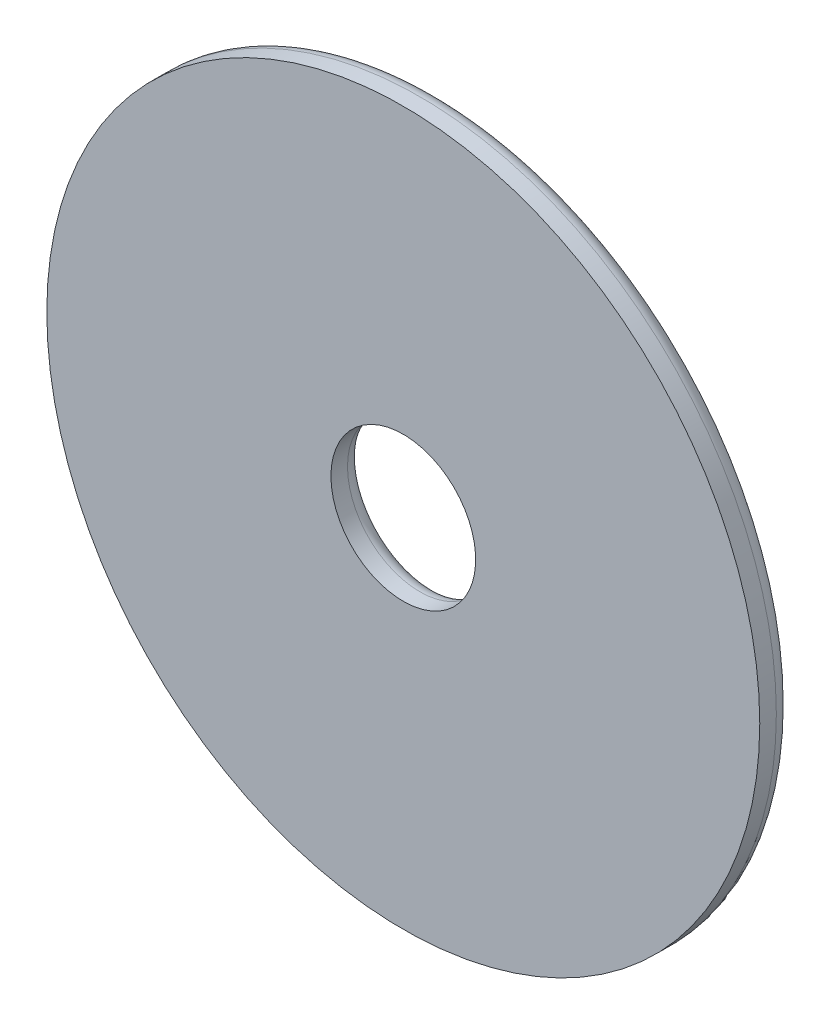
ISO-10303-21;
HEADER;
FILE_DESCRIPTION(('STEP AP214'),'2;1');
FILE_NAME('part.step','',(''),(''),'','','');
FILE_SCHEMA(('AUTOMOTIVE_DESIGN { 1 0 10303 214 1 1 1 1 }'));
ENDSEC;
DATA;
#1=APPLICATION_CONTEXT('core data for automotive mechanical design processes');
#2=APPLICATION_PROTOCOL_DEFINITION('international standard','automotive_design',2000,#1);
#3=PRODUCT_CONTEXT('',#1,'mechanical');
#4=PRODUCT('Part','Part','',(#3));
#5=PRODUCT_RELATED_PRODUCT_CATEGORY('part','',(#4));
#6=PRODUCT_DEFINITION_FORMATION('','',#4);
#7=PRODUCT_DEFINITION_CONTEXT('part definition',#1,'design');
#8=PRODUCT_DEFINITION('design','',#6,#7);
#9=PRODUCT_DEFINITION_SHAPE('','',#8);
#10=(LENGTH_UNIT() NAMED_UNIT(*) SI_UNIT(.MILLI.,.METRE.));
#11=(NAMED_UNIT(*) PLANE_ANGLE_UNIT() SI_UNIT($,.RADIAN.));
#12=(NAMED_UNIT(*) SI_UNIT($,.STERADIAN.) SOLID_ANGLE_UNIT());
#13=UNCERTAINTY_MEASURE_WITH_UNIT(LENGTH_MEASURE(1.E-05),#10,'distance_accuracy_value','');
#14=(GEOMETRIC_REPRESENTATION_CONTEXT(3) GLOBAL_UNCERTAINTY_ASSIGNED_CONTEXT((#13)) GLOBAL_UNIT_ASSIGNED_CONTEXT((#10,
#11,#12)) REPRESENTATION_CONTEXT('',''));
#15=CARTESIAN_POINT('',(0.,0.,0.));
#16=DIRECTION('',(0.,0.,1.));
#17=DIRECTION('',(1.,0.,0.));
#18=AXIS2_PLACEMENT_3D('',#15,#16,#17);
#19=CARTESIAN_POINT('',(0.,0.,0.590550000000005));
#20=DIRECTION('',(0.,0.,1.));
#21=DIRECTION('',(1.,0.,0.));
#22=AXIS2_PLACEMENT_3D('',#19,#20,#21);
#23=PLANE('',#22);
#24=CARTESIAN_POINT('',(0.,0.,0.590550000000005));
#25=DIRECTION('',(0.,0.,1.));
#26=DIRECTION('',(1.,0.,0.));
#27=AXIS2_PLACEMENT_3D('',#24,#25,#26);
#28=CIRCLE('',#27,12.7);
#29=CARTESIAN_POINT('',(-12.7,0.,0.590550000000005));
#30=VERTEX_POINT('',#29);
#31=EDGE_CURVE('E65',#30,#30,#28,.T.);
#32=ORIENTED_EDGE('',*,*,#31,.T.);
#33=EDGE_LOOP('',(#32));
#34=FACE_BOUND('',#33,.T.);
#35=CARTESIAN_POINT('',(0.,0.,0.590550000000005));
#36=DIRECTION('',(0.,0.,1.));
#37=DIRECTION('',(1.,0.,0.));
#38=AXIS2_PLACEMENT_3D('',#35,#36,#37);
#39=CIRCLE('',#38,2.5781);
#40=CARTESIAN_POINT('',(-2.5781,0.,0.590550000000005));
#41=VERTEX_POINT('',#40);
#42=EDGE_CURVE('E69',#41,#41,#39,.T.);
#43=ORIENTED_EDGE('',*,*,#42,.F.);
#44=EDGE_LOOP('',(#43));
#45=FACE_BOUND('',#44,.T.);
#46=ADVANCED_FACE('F41',(#34,#45),#23,.T.);
#47=CARTESIAN_POINT('',(0.,0.,0.590550000000005));
#48=DIRECTION('',(0.,0.,-1.));
#49=DIRECTION('',(-1.,0.,0.));
#50=AXIS2_PLACEMENT_3D('',#47,#48,#49);
#51=CYLINDRICAL_SURFACE('',#50,12.7);
#52=CARTESIAN_POINT('',(0.,0.,0.));
#53=DIRECTION('',(0.,0.,1.));
#54=DIRECTION('',(1.,0.,0.));
#55=AXIS2_PLACEMENT_3D('',#52,#53,#54);
#56=CIRCLE('',#55,12.7);
#57=CARTESIAN_POINT('',(-12.7,0.,0.));
#58=VERTEX_POINT('',#57);
#59=EDGE_CURVE('E59',#58,#58,#56,.T.);
#60=CARTESIAN_POINT('',(-12.7,0.,0.));
#61=CARTESIAN_POINT('',(-12.7,0.,0.00615156249999532));
#62=CARTESIAN_POINT('',(-12.7,0.,0.0123031249999954));
#63=CARTESIAN_POINT('',(-12.7,0.,0.0246062499999956));
#64=CARTESIAN_POINT('',(-12.7,0.,0.0307578124999957));
#65=CARTESIAN_POINT('',(-12.7,0.,0.0430609374999959));
#66=CARTESIAN_POINT('',(-12.7,0.,0.049212499999996));
#67=CARTESIAN_POINT('',(-12.7,0.,0.0615156249999962));
#68=CARTESIAN_POINT('',(-12.7,0.,0.0676671874999963));
#69=CARTESIAN_POINT('',(-12.7,0.,0.0799703124999965));
#70=CARTESIAN_POINT('',(-12.7,0.,0.0861218749999966));
#71=CARTESIAN_POINT('',(-12.7,0.,0.0984249999999968));
#72=CARTESIAN_POINT('',(-12.7,0.,0.104576562499997));
#73=CARTESIAN_POINT('',(-12.7,0.,0.116879687499997));
#74=CARTESIAN_POINT('',(-12.7,0.,0.123031249999997));
#75=CARTESIAN_POINT('',(-12.7,0.,0.135334374999997));
#76=CARTESIAN_POINT('',(-12.7,0.,0.141485937499997));
#77=CARTESIAN_POINT('',(-12.7,0.,0.153789062499998));
#78=CARTESIAN_POINT('',(-12.7,0.,0.159940624999998));
#79=CARTESIAN_POINT('',(-12.7,0.,0.172243749999998));
#80=CARTESIAN_POINT('',(-12.7,0.,0.178395312499998));
#81=CARTESIAN_POINT('',(-12.7,0.,0.190698437499998));
#82=CARTESIAN_POINT('',(-12.7,0.,0.196849999999998));
#83=CARTESIAN_POINT('',(-12.7,0.,0.209153124999999));
#84=CARTESIAN_POINT('',(-12.7,0.,0.215304687499999));
#85=CARTESIAN_POINT('',(-12.7,0.,0.227607812499999));
#86=CARTESIAN_POINT('',(-12.7,0.,0.233759374999999));
#87=CARTESIAN_POINT('',(-12.7,0.,0.246062499999999));
#88=CARTESIAN_POINT('',(-12.7,0.,0.252214062499999));
#89=CARTESIAN_POINT('',(-12.7,0.,0.264517187499999));
#90=CARTESIAN_POINT('',(-12.7,0.,0.27066875));
#91=CARTESIAN_POINT('',(-12.7,0.,0.282971875));
#92=CARTESIAN_POINT('',(-12.7,0.,0.2891234375));
#93=CARTESIAN_POINT('',(-12.7,0.,0.3014265625));
#94=CARTESIAN_POINT('',(-12.7,0.,0.307578125));
#95=CARTESIAN_POINT('',(-12.7,0.,0.31988125));
#96=CARTESIAN_POINT('',(-12.7,0.,0.3260328125));
#97=CARTESIAN_POINT('',(-12.7,0.,0.338335937500001));
#98=CARTESIAN_POINT('',(-12.7,0.,0.344487500000001));
#99=CARTESIAN_POINT('',(-12.7,0.,0.356790625000001));
#100=CARTESIAN_POINT('',(-12.7,0.,0.362942187500001));
#101=CARTESIAN_POINT('',(-12.7,0.,0.375245312500001));
#102=CARTESIAN_POINT('',(-12.7,0.,0.381396875000001));
#103=CARTESIAN_POINT('',(-12.7,0.,0.393700000000002));
#104=CARTESIAN_POINT('',(-12.7,0.,0.399851562500002));
#105=CARTESIAN_POINT('',(-12.7,0.,0.412154687500002));
#106=CARTESIAN_POINT('',(-12.7,0.,0.418306250000002));
#107=CARTESIAN_POINT('',(-12.7,0.,0.430609375000002));
#108=CARTESIAN_POINT('',(-12.7,0.,0.436760937500002));
#109=CARTESIAN_POINT('',(-12.7,0.,0.449064062500002));
#110=CARTESIAN_POINT('',(-12.7,0.,0.455215625000002));
#111=CARTESIAN_POINT('',(-12.7,0.,0.467518750000003));
#112=CARTESIAN_POINT('',(-12.7,0.,0.473670312500003));
#113=CARTESIAN_POINT('',(-12.7,0.,0.485973437500003));
#114=CARTESIAN_POINT('',(-12.7,0.,0.492125000000003));
#115=CARTESIAN_POINT('',(-12.7,0.,0.504428125000003));
#116=CARTESIAN_POINT('',(-12.7,0.,0.510579687500003));
#117=CARTESIAN_POINT('',(-12.7,0.,0.522882812500004));
#118=CARTESIAN_POINT('',(-12.7,0.,0.529034375000004));
#119=CARTESIAN_POINT('',(-12.7,0.,0.541337500000004));
#120=CARTESIAN_POINT('',(-12.7,0.,0.547489062500004));
#121=CARTESIAN_POINT('',(-12.7,0.,0.559792187500004));
#122=CARTESIAN_POINT('',(-12.7,0.,0.565943750000004));
#123=CARTESIAN_POINT('',(-12.7,0.,0.578246875000004));
#124=CARTESIAN_POINT('',(-12.7,0.,0.584398437500005));
#125=CARTESIAN_POINT('',(-12.7,0.,0.590550000000005));
#126=B_SPLINE_CURVE_WITH_KNOTS('',3,(#60,#61,#62,#63,#64,#65,#66,#67,#68,#69,#70,#71,#72,#73,
#74,#75,#76,#77,#78,#79,#80,#81,#82,#83,#84,#85,#86,#87,#88,#89,#90,#91,#92,#93,#94,#95,#96,#97,
#98,#99,#100,#101,#102,#103,#104,#105,#106,#107,#108,#109,#110,#111,#112,#113,#114,#115,#116,
#117,#118,#119,#120,#121,#122,#123,#124,#125),.UNSPECIFIED.,.F.,.F.,(4,2,2,2,2,2,2,2,2,2,2,2,2,
2,2,2,2,2,2,2,2,2,2,2,2,2,2,2,2,2,2,2,4),(0.,0.0184546875000003,0.0369093750000006,
0.0553640625000009,0.0738187500000011,0.0922734375000015,0.110728125000002,0.129182812500002,
0.147637500000002,0.166092187500003,0.184546875000003,0.203001562500003,0.221456250000004,
0.239910937500004,0.258365625000004,0.276820312500004,0.295275000000005,0.313729687500005,
0.332184375000005,0.350639062500006,0.369093750000006,0.387548437500006,0.406003125000007,
0.424457812500007,0.442912500000007,0.461367187500007,0.479821875000008,0.498276562500008,
0.516731250000008,0.535185937500009,0.553640625000009,0.572095312500009,0.590550000000009),.UNSPECIFIED.);
#127=EDGE_CURVE('BSEAM77',#58,#30,#126,.T.);
#128=ORIENTED_EDGE('',*,*,#59,.T.);
#129=ORIENTED_EDGE('',*,*,#31,.F.);
#130=ORIENTED_EDGE('',*,*,#127,.T.);
#131=ORIENTED_EDGE('',*,*,#127,.F.);
#132=EDGE_LOOP('',(#128,#130,#129,#131));
#133=FACE_BOUND('',#132,.T.);
#134=ADVANCED_FACE('F77',(#133),#51,.T.);
#135=CARTESIAN_POINT('',(0.,0.,0.590550000000005));
#136=DIRECTION('',(0.,0.,-1.));
#137=DIRECTION('',(-1.,0.,0.));
#138=AXIS2_PLACEMENT_3D('',#135,#136,#137);
#139=CYLINDRICAL_SURFACE('',#138,2.5781);
#140=CARTESIAN_POINT('',(0.,0.,0.));
#141=DIRECTION('',(0.,0.,1.));
#142=DIRECTION('',(1.,0.,0.));
#143=AXIS2_PLACEMENT_3D('',#140,#141,#142);
#144=CIRCLE('',#143,2.5781);
#145=CARTESIAN_POINT('',(-2.5781,0.,0.));
#146=VERTEX_POINT('',#145);
#147=EDGE_CURVE('E10',#146,#146,#144,.F.);
#148=CARTESIAN_POINT('',(-2.5781,0.,0.));
#149=CARTESIAN_POINT('',(-2.5781,0.,0.00615156249999532));
#150=CARTESIAN_POINT('',(-2.5781,0.,0.0123031249999954));
#151=CARTESIAN_POINT('',(-2.5781,0.,0.0246062499999956));
#152=CARTESIAN_POINT('',(-2.5781,0.,0.0307578124999957));
#153=CARTESIAN_POINT('',(-2.5781,0.,0.0430609374999959));
#154=CARTESIAN_POINT('',(-2.5781,0.,0.049212499999996));
#155=CARTESIAN_POINT('',(-2.5781,0.,0.0615156249999962));
#156=CARTESIAN_POINT('',(-2.5781,0.,0.0676671874999963));
#157=CARTESIAN_POINT('',(-2.5781,0.,0.0799703124999965));
#158=CARTESIAN_POINT('',(-2.5781,0.,0.0861218749999966));
#159=CARTESIAN_POINT('',(-2.5781,0.,0.0984249999999968));
#160=CARTESIAN_POINT('',(-2.5781,0.,0.104576562499997));
#161=CARTESIAN_POINT('',(-2.5781,0.,0.116879687499997));
#162=CARTESIAN_POINT('',(-2.5781,0.,0.123031249999997));
#163=CARTESIAN_POINT('',(-2.5781,0.,0.135334374999997));
#164=CARTESIAN_POINT('',(-2.5781,0.,0.141485937499997));
#165=CARTESIAN_POINT('',(-2.5781,0.,0.153789062499998));
#166=CARTESIAN_POINT('',(-2.5781,0.,0.159940624999998));
#167=CARTESIAN_POINT('',(-2.5781,0.,0.172243749999998));
#168=CARTESIAN_POINT('',(-2.5781,0.,0.178395312499998));
#169=CARTESIAN_POINT('',(-2.5781,0.,0.190698437499998));
#170=CARTESIAN_POINT('',(-2.5781,0.,0.196849999999998));
#171=CARTESIAN_POINT('',(-2.5781,0.,0.209153124999998));
#172=CARTESIAN_POINT('',(-2.5781,0.,0.215304687499999));
#173=CARTESIAN_POINT('',(-2.5781,0.,0.227607812499999));
#174=CARTESIAN_POINT('',(-2.5781,0.,0.233759374999999));
#175=CARTESIAN_POINT('',(-2.5781,0.,0.246062499999999));
#176=CARTESIAN_POINT('',(-2.5781,0.,0.252214062499999));
#177=CARTESIAN_POINT('',(-2.5781,0.,0.264517187499999));
#178=CARTESIAN_POINT('',(-2.5781,0.,0.27066875));
#179=CARTESIAN_POINT('',(-2.5781,0.,0.282971875));
#180=CARTESIAN_POINT('',(-2.5781,0.,0.2891234375));
#181=CARTESIAN_POINT('',(-2.5781,0.,0.3014265625));
#182=CARTESIAN_POINT('',(-2.5781,0.,0.307578125));
#183=CARTESIAN_POINT('',(-2.5781,0.,0.31988125));
#184=CARTESIAN_POINT('',(-2.5781,0.,0.3260328125));
#185=CARTESIAN_POINT('',(-2.5781,0.,0.338335937500001));
#186=CARTESIAN_POINT('',(-2.5781,0.,0.344487500000001));
#187=CARTESIAN_POINT('',(-2.5781,0.,0.356790625000001));
#188=CARTESIAN_POINT('',(-2.5781,0.,0.362942187500001));
#189=CARTESIAN_POINT('',(-2.5781,0.,0.375245312500001));
#190=CARTESIAN_POINT('',(-2.5781,0.,0.381396875000001));
#191=CARTESIAN_POINT('',(-2.5781,0.,0.393700000000001));
#192=CARTESIAN_POINT('',(-2.5781,0.,0.399851562500001));
#193=CARTESIAN_POINT('',(-2.5781,0.,0.412154687500002));
#194=CARTESIAN_POINT('',(-2.5781,0.,0.418306250000002));
#195=CARTESIAN_POINT('',(-2.5781,0.,0.430609375000002));
#196=CARTESIAN_POINT('',(-2.5781,0.,0.436760937500002));
#197=CARTESIAN_POINT('',(-2.5781,0.,0.449064062500002));
#198=CARTESIAN_POINT('',(-2.5781,0.,0.455215625000002));
#199=CARTESIAN_POINT('',(-2.5781,0.,0.467518750000003));
#200=CARTESIAN_POINT('',(-2.5781,0.,0.473670312500003));
#201=CARTESIAN_POINT('',(-2.5781,0.,0.485973437500003));
#202=CARTESIAN_POINT('',(-2.5781,0.,0.492125000000003));
#203=CARTESIAN_POINT('',(-2.5781,0.,0.504428125000003));
#204=CARTESIAN_POINT('',(-2.5781,0.,0.510579687500003));
#205=CARTESIAN_POINT('',(-2.5781,0.,0.522882812500003));
#206=CARTESIAN_POINT('',(-2.5781,0.,0.529034375000004));
#207=CARTESIAN_POINT('',(-2.5781,0.,0.541337500000004));
#208=CARTESIAN_POINT('',(-2.5781,0.,0.547489062500004));
#209=CARTESIAN_POINT('',(-2.5781,0.,0.559792187500004));
#210=CARTESIAN_POINT('',(-2.5781,0.,0.565943750000004));
#211=CARTESIAN_POINT('',(-2.5781,0.,0.578246875000004));
#212=CARTESIAN_POINT('',(-2.5781,0.,0.584398437500005));
#213=CARTESIAN_POINT('',(-2.5781,0.,0.590550000000005));
#214=B_SPLINE_CURVE_WITH_KNOTS('',3,(#148,#149,#150,#151,#152,#153,#154,#155,#156,#157,#158,
#159,#160,#161,#162,#163,#164,#165,#166,#167,#168,#169,#170,#171,#172,#173,#174,#175,#176,#177,
#178,#179,#180,#181,#182,#183,#184,#185,#186,#187,#188,#189,#190,#191,#192,#193,#194,#195,#196,
#197,#198,#199,#200,#201,#202,#203,#204,#205,#206,#207,#208,#209,#210,#211,#212,#213),
.UNSPECIFIED.,.F.,.F.,(4,2,2,2,2,2,2,2,2,2,2,2,2,2,2,2,2,2,2,2,2,2,2,2,2,2,2,2,2,2,2,2,4),(0.,
0.0184546875000003,0.0369093750000006,0.0553640625000009,0.0738187500000011,0.0922734375000014,
0.110728125000002,0.129182812500002,0.147637500000002,0.166092187500003,0.184546875000003,
0.203001562500003,0.221456250000003,0.239910937500004,0.258365625000004,0.276820312500004,
0.295275000000005,0.313729687500005,0.332184375000005,0.350639062500006,0.369093750000006,
0.387548437500006,0.406003125000006,0.424457812500007,0.442912500000007,0.461367187500007,
0.479821875000008,0.498276562500008,0.516731250000008,0.535185937500009,0.553640625000009,
0.572095312500009,0.590550000000009),.UNSPECIFIED.);
#215=EDGE_CURVE('BSEAM74',#146,#41,#214,.T.);
#216=ORIENTED_EDGE('',*,*,#147,.T.);
#217=ORIENTED_EDGE('',*,*,#42,.T.);
#218=ORIENTED_EDGE('',*,*,#215,.T.);
#219=ORIENTED_EDGE('',*,*,#215,.F.);
#220=EDGE_LOOP('',(#216,#218,#217,#219));
#221=FACE_BOUND('',#220,.T.);
#222=ADVANCED_FACE('F74',(#221),#139,.F.);
#223=CARTESIAN_POINT('',(0.,0.,-0.590550000000005));
#224=DIRECTION('',(0.,0.,1.));
#225=DIRECTION('',(1.,0.,0.));
#226=AXIS2_PLACEMENT_3D('',#223,#224,#225);
#227=PLANE('',#226);
#228=CARTESIAN_POINT('',(0.,0.,-0.590550000000005));
#229=DIRECTION('',(0.,0.,1.));
#230=DIRECTION('',(1.,0.,0.));
#231=AXIS2_PLACEMENT_3D('',#228,#229,#230);
#232=CIRCLE('',#231,12.10945);
#233=CARTESIAN_POINT('',(12.10945,0.,-0.590550000000005));
#234=VERTEX_POINT('',#233);
#235=EDGE_CURVE('E49',#234,#234,#232,.F.);
#236=ORIENTED_EDGE('',*,*,#235,.T.);
#237=EDGE_LOOP('',(#236));
#238=FACE_BOUND('',#237,.T.);
#239=CARTESIAN_POINT('',(0.,0.,-0.590550000000005));
#240=DIRECTION('',(0.,0.,1.));
#241=DIRECTION('',(1.,0.,0.));
#242=AXIS2_PLACEMENT_3D('',#239,#240,#241);
#243=CIRCLE('',#242,3.16865);
#244=CARTESIAN_POINT('',(3.16865,0.,-0.590550000000005));
#245=VERTEX_POINT('',#244);
#246=EDGE_CURVE('E54',#245,#245,#243,.T.);
#247=ORIENTED_EDGE('',*,*,#246,.T.);
#248=EDGE_LOOP('',(#247));
#249=FACE_BOUND('',#248,.T.);
#250=ADVANCED_FACE('F89',(#238,#249),#227,.F.);
#251=CARTESIAN_POINT('',(0.,0.,0.));
#252=DIRECTION('',(0.,0.,1.));
#253=DIRECTION('',(1.,0.,0.));
#254=AXIS2_PLACEMENT_3D('',#251,#252,#253);
#255=TOROIDAL_SURFACE('',#254,12.10945,0.59055);
#256=ORIENTED_EDGE('',*,*,#235,.F.);
#257=EDGE_LOOP('',(#256));
#258=FACE_BOUND('',#257,.T.);
#259=ORIENTED_EDGE('',*,*,#59,.F.);
#260=EDGE_LOOP('',(#259));
#261=FACE_BOUND('',#260,.T.);
#262=ADVANCED_FACE('F87',(#258,#261),#255,.T.);
#263=CARTESIAN_POINT('',(0.,0.,0.));
#264=DIRECTION('',(0.,0.,1.));
#265=DIRECTION('',(1.,0.,0.));
#266=AXIS2_PLACEMENT_3D('',#263,#264,#265);
#267=TOROIDAL_SURFACE('',#266,3.16865,0.59055);
#268=ORIENTED_EDGE('',*,*,#147,.F.);
#269=EDGE_LOOP('',(#268));
#270=FACE_BOUND('',#269,.T.);
#271=ORIENTED_EDGE('',*,*,#246,.F.);
#272=EDGE_LOOP('',(#271));
#273=FACE_BOUND('',#272,.T.);
#274=ADVANCED_FACE('F43',(#270,#273),#267,.T.);
#275=CLOSED_SHELL('',(#46,#134,#222,#250,#262,#274));
#276=MANIFOLD_SOLID_BREP('B2',#275);
#277=ADVANCED_BREP_SHAPE_REPRESENTATION('',(#18,#276),#14);
#278=SHAPE_DEFINITION_REPRESENTATION(#9,#277);
ENDSEC;
END-ISO-10303-21;
